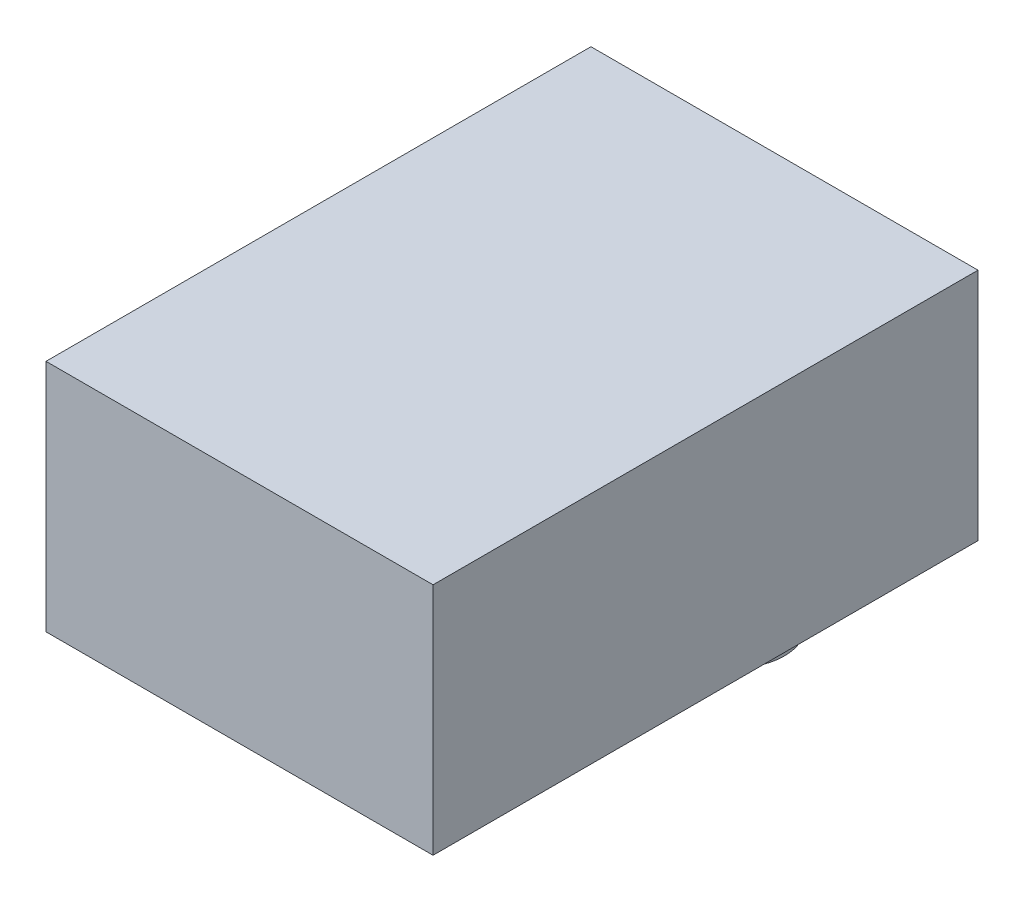
ISO-10303-21;
HEADER;
FILE_DESCRIPTION(('STEP AP214'),'2;1');
FILE_NAME('part.step','',(''),(''),'','','');
FILE_SCHEMA(('AUTOMOTIVE_DESIGN { 1 0 10303 214 1 1 1 1 }'));
ENDSEC;
DATA;
#1=APPLICATION_CONTEXT('core data for automotive mechanical design processes');
#2=APPLICATION_PROTOCOL_DEFINITION('international standard','automotive_design',2000,#1);
#3=PRODUCT_CONTEXT('',#1,'mechanical');
#4=PRODUCT('Part','Part','',(#3));
#5=PRODUCT_RELATED_PRODUCT_CATEGORY('part','',(#4));
#6=PRODUCT_DEFINITION_FORMATION('','',#4);
#7=PRODUCT_DEFINITION_CONTEXT('part definition',#1,'design');
#8=PRODUCT_DEFINITION('design','',#6,#7);
#9=PRODUCT_DEFINITION_SHAPE('','',#8);
#10=(LENGTH_UNIT() NAMED_UNIT(*) SI_UNIT(.MILLI.,.METRE.));
#11=(NAMED_UNIT(*) PLANE_ANGLE_UNIT() SI_UNIT($,.RADIAN.));
#12=(NAMED_UNIT(*) SI_UNIT($,.STERADIAN.) SOLID_ANGLE_UNIT());
#13=UNCERTAINTY_MEASURE_WITH_UNIT(LENGTH_MEASURE(1.E-05),#10,'distance_accuracy_value','');
#14=(GEOMETRIC_REPRESENTATION_CONTEXT(3) GLOBAL_UNCERTAINTY_ASSIGNED_CONTEXT((#13)) GLOBAL_UNIT_ASSIGNED_CONTEXT((#10,
#11,#12)) REPRESENTATION_CONTEXT('',''));
#15=CARTESIAN_POINT('',(0.,0.,0.));
#16=DIRECTION('',(0.,0.,1.));
#17=DIRECTION('',(1.,0.,0.));
#18=AXIS2_PLACEMENT_3D('',#15,#16,#17);
#19=CARTESIAN_POINT('',(0.,9.3,0.));
#20=DIRECTION('',(0.,-1.,0.));
#21=DIRECTION('',(0.,0.,-1.));
#22=AXIS2_PLACEMENT_3D('',#19,#20,#21);
#23=CYLINDRICAL_SURFACE('',#22,2.35);
#24=CARTESIAN_POINT('',(0.,0.,0.));
#25=DIRECTION('',(0.,1.,0.));
#26=DIRECTION('',(0.,0.,1.));
#27=AXIS2_PLACEMENT_3D('',#24,#25,#26);
#28=CIRCLE('',#27,2.35);
#29=CARTESIAN_POINT('',(0.,0.,2.35));
#30=VERTEX_POINT('',#29);
#31=EDGE_CURVE('E181',#30,#30,#28,.T.);
#32=ORIENTED_EDGE('',*,*,#31,.F.);
#33=EDGE_LOOP('',(#32));
#34=FACE_BOUND('',#33,.T.);
#35=CARTESIAN_POINT('',(0.,2.8,0.));
#36=DIRECTION('',(0.,1.,0.));
#37=DIRECTION('',(0.,0.,1.));
#38=AXIS2_PLACEMENT_3D('',#35,#36,#37);
#39=CIRCLE('',#38,2.35);
#40=CARTESIAN_POINT('',(0.,2.8,2.35));
#41=VERTEX_POINT('',#40);
#42=EDGE_CURVE('E53',#41,#41,#39,.T.);
#43=ORIENTED_EDGE('',*,*,#42,.T.);
#44=EDGE_LOOP('',(#43));
#45=FACE_BOUND('',#44,.T.);
#46=ADVANCED_FACE('F51',(#34,#45),#23,.F.);
#47=CARTESIAN_POINT('',(0.,9.3,0.));
#48=DIRECTION('',(0.,-1.,0.));
#49=DIRECTION('',(0.,0.,-1.));
#50=AXIS2_PLACEMENT_3D('',#47,#48,#49);
#51=CYLINDRICAL_SURFACE('',#50,5.);
#52=CARTESIAN_POINT('',(0.,0.,0.));
#53=DIRECTION('',(0.,1.,0.));
#54=DIRECTION('',(0.,0.,1.));
#55=AXIS2_PLACEMENT_3D('',#52,#53,#54);
#56=CIRCLE('',#55,5.);
#57=CARTESIAN_POINT('',(-3.87136521046086,0.,-3.16425842927428));
#58=VERTEX_POINT('',#57);
#59=CARTESIAN_POINT('',(0.5,0.,-4.9749371855331));
#60=VERTEX_POINT('',#59);
#61=EDGE_CURVE('E121',#58,#60,#56,.T.);
#62=ORIENTED_EDGE('',*,*,#61,.T.);
#63=DIRECTION('',(0.,-1.,0.));
#64=VECTOR('',#63,1.);
#65=CARTESIAN_POINT('',(0.5,9.3,-4.9749371855331));
#66=LINE('',#65,#64);
#67=CARTESIAN_POINT('',(0.5,9.3,-4.9749371855331));
#68=VERTEX_POINT('',#67);
#69=EDGE_CURVE('E12',#68,#60,#66,.T.);
#70=ORIENTED_EDGE('',*,*,#69,.F.);
#71=CARTESIAN_POINT('',(0.,9.3,0.));
#72=DIRECTION('',(0.,1.,0.));
#73=DIRECTION('',(0.,0.,1.));
#74=AXIS2_PLACEMENT_3D('',#71,#72,#73);
#75=CIRCLE('',#74,5.);
#76=CARTESIAN_POINT('',(-3.87136521046086,9.3,-3.16425842927428));
#77=VERTEX_POINT('',#76);
#78=EDGE_CURVE('E123',#77,#68,#75,.T.);
#79=ORIENTED_EDGE('',*,*,#78,.F.);
#80=DIRECTION('',(0.,-1.,0.));
#81=VECTOR('',#80,1.);
#82=CARTESIAN_POINT('',(-3.87136521046086,9.3,-3.16425842927428));
#83=LINE('',#82,#81);
#84=EDGE_CURVE('E106',#77,#58,#83,.T.);
#85=ORIENTED_EDGE('',*,*,#84,.T.);
#86=EDGE_LOOP('',(#62,#70,#79,#85));
#87=FACE_BOUND('',#86,.T.);
#88=ADVANCED_FACE('F306',(#87),#51,.T.);
#89=CARTESIAN_POINT('',(0.5,9.3,0.));
#90=DIRECTION('',(1.,0.,0.));
#91=DIRECTION('',(0.,0.,-1.));
#92=AXIS2_PLACEMENT_3D('',#89,#90,#91);
#93=PLANE('',#92);
#94=DIRECTION('',(0.,0.,1.));
#95=VECTOR('',#94,1.);
#96=CARTESIAN_POINT('',(0.5,0.,0.));
#97=LINE('',#96,#95);
#98=CARTESIAN_POINT('',(0.5,0.,-7.));
#99=VERTEX_POINT('',#98);
#100=EDGE_CURVE('E165',#99,#60,#97,.T.);
#101=ORIENTED_EDGE('',*,*,#100,.F.);
#102=DIRECTION('',(0.,-1.,0.));
#103=VECTOR('',#102,1.);
#104=CARTESIAN_POINT('',(0.5,9.3,-7.));
#105=LINE('',#104,#103);
#106=CARTESIAN_POINT('',(0.5,9.3,-7.));
#107=VERTEX_POINT('',#106);
#108=EDGE_CURVE('E63',#107,#99,#105,.T.);
#109=ORIENTED_EDGE('',*,*,#108,.F.);
#110=DIRECTION('',(0.,0.,1.));
#111=VECTOR('',#110,1.);
#112=CARTESIAN_POINT('',(0.5,9.3,0.));
#113=LINE('',#112,#111);
#114=EDGE_CURVE('E126',#107,#68,#113,.T.);
#115=ORIENTED_EDGE('',*,*,#114,.T.);
#116=ORIENTED_EDGE('',*,*,#69,.T.);
#117=EDGE_LOOP('',(#101,#109,#115,#116));
#118=FACE_BOUND('',#117,.T.);
#119=ADVANCED_FACE('F162',(#118),#93,.T.);
#120=CARTESIAN_POINT('',(0.,9.3,-7.));
#121=DIRECTION('',(0.,0.,-1.));
#122=DIRECTION('',(-1.,0.,0.));
#123=AXIS2_PLACEMENT_3D('',#120,#121,#122);
#124=PLANE('',#123);
#125=DIRECTION('',(1.,0.,0.));
#126=VECTOR('',#125,1.);
#127=CARTESIAN_POINT('',(0.,0.,-7.));
#128=LINE('',#127,#126);
#129=CARTESIAN_POINT('',(-0.5,0.,-7.));
#130=VERTEX_POINT('',#129);
#131=EDGE_CURVE('E154',#130,#99,#128,.T.);
#132=ORIENTED_EDGE('',*,*,#131,.F.);
#133=DIRECTION('',(0.,-1.,0.));
#134=VECTOR('',#133,1.);
#135=CARTESIAN_POINT('',(-0.5,9.3,-7.));
#136=LINE('',#135,#134);
#137=CARTESIAN_POINT('',(-0.5,9.3,-7.));
#138=VERTEX_POINT('',#137);
#139=EDGE_CURVE('E141',#138,#130,#136,.T.);
#140=ORIENTED_EDGE('',*,*,#139,.F.);
#141=DIRECTION('',(1.,0.,0.));
#142=VECTOR('',#141,1.);
#143=CARTESIAN_POINT('',(0.,9.3,-7.));
#144=LINE('',#143,#142);
#145=EDGE_CURVE('E157',#138,#107,#144,.T.);
#146=ORIENTED_EDGE('',*,*,#145,.T.);
#147=ORIENTED_EDGE('',*,*,#108,.T.);
#148=EDGE_LOOP('',(#132,#140,#146,#147));
#149=FACE_BOUND('',#148,.T.);
#150=ADVANCED_FACE('F155',(#149),#124,.T.);
#151=CARTESIAN_POINT('',(-0.5,9.3,0.));
#152=DIRECTION('',(-1.,0.,0.));
#153=DIRECTION('',(0.,0.,1.));
#154=AXIS2_PLACEMENT_3D('',#151,#152,#153);
#155=PLANE('',#154);
#156=DIRECTION('',(0.,0.,-1.));
#157=VECTOR('',#156,1.);
#158=CARTESIAN_POINT('',(-0.5,0.,0.));
#159=LINE('',#158,#157);
#160=CARTESIAN_POINT('',(-0.5,0.,-4.9749371855331));
#161=VERTEX_POINT('',#160);
#162=EDGE_CURVE('E166',#161,#130,#159,.T.);
#163=ORIENTED_EDGE('',*,*,#162,.F.);
#164=DIRECTION('',(0.,-1.,0.));
#165=VECTOR('',#164,1.);
#166=CARTESIAN_POINT('',(-0.5,9.3,-4.9749371855331));
#167=LINE('',#166,#165);
#168=CARTESIAN_POINT('',(-0.5,9.3,-4.9749371855331));
#169=VERTEX_POINT('',#168);
#170=EDGE_CURVE('E137',#169,#161,#167,.T.);
#171=ORIENTED_EDGE('',*,*,#170,.F.);
#172=DIRECTION('',(0.,0.,-1.));
#173=VECTOR('',#172,1.);
#174=CARTESIAN_POINT('',(-0.5,9.3,0.));
#175=LINE('',#174,#173);
#176=EDGE_CURVE('E203',#169,#138,#175,.T.);
#177=ORIENTED_EDGE('',*,*,#176,.T.);
#178=ORIENTED_EDGE('',*,*,#139,.T.);
#179=EDGE_LOOP('',(#163,#171,#177,#178));
#180=FACE_BOUND('',#179,.T.);
#181=ADVANCED_FACE('F325',(#180),#155,.T.);
#182=CARTESIAN_POINT('',(-3.16425842927432,0.,-3.87136521046083));
#183=VERTEX_POINT('',#182);
#184=EDGE_CURVE('E172',#161,#183,#56,.T.);
#185=ORIENTED_EDGE('',*,*,#184,.T.);
#186=DIRECTION('',(0.,-1.,0.));
#187=VECTOR('',#186,1.);
#188=CARTESIAN_POINT('',(-3.16425842927432,9.3,-3.87136521046083));
#189=LINE('',#188,#187);
#190=CARTESIAN_POINT('',(-3.16425842927432,9.3,-3.87136521046083));
#191=VERTEX_POINT('',#190);
#192=EDGE_CURVE('E136',#191,#183,#189,.T.);
#193=ORIENTED_EDGE('',*,*,#192,.F.);
#194=EDGE_CURVE('E128',#169,#191,#75,.T.);
#195=ORIENTED_EDGE('',*,*,#194,.F.);
#196=ORIENTED_EDGE('',*,*,#170,.T.);
#197=EDGE_LOOP('',(#185,#193,#195,#196));
#198=FACE_BOUND('',#197,.T.);
#199=ADVANCED_FACE('F313',(#198),#51,.T.);
#200=CARTESIAN_POINT('',(0.353553390593269,9.3,-0.353553390593271));
#201=DIRECTION('',(0.707106781186545,0.,-0.70710678118655));
#202=DIRECTION('',(-0.70710678118655,0.,-0.707106781186545));
#203=AXIS2_PLACEMENT_3D('',#200,#201,#202);
#204=PLANE('',#203);
#205=DIRECTION('',(0.70710678118655,0.,0.707106781186545));
#206=VECTOR('',#205,1.);
#207=CARTESIAN_POINT('',(0.353553390593269,0.,-0.353553390593271));
#208=LINE('',#207,#206);
#209=CARTESIAN_POINT('',(-4.58355102393963,0.,-5.29065780512613));
#210=VERTEX_POINT('',#209);
#211=EDGE_CURVE('E118',#210,#183,#208,.T.);
#212=ORIENTED_EDGE('',*,*,#211,.F.);
#213=DIRECTION('',(0.,-1.,0.));
#214=VECTOR('',#213,1.);
#215=CARTESIAN_POINT('',(-4.58355102393963,9.3,-5.29065780512613));
#216=LINE('',#215,#214);
#217=CARTESIAN_POINT('',(-4.58355102393963,9.3,-5.29065780512613));
#218=VERTEX_POINT('',#217);
#219=EDGE_CURVE('E104',#218,#210,#216,.T.);
#220=ORIENTED_EDGE('',*,*,#219,.F.);
#221=DIRECTION('',(0.70710678118655,0.,0.707106781186545));
#222=VECTOR('',#221,1.);
#223=CARTESIAN_POINT('',(0.353553390593269,9.3,-0.353553390593271));
#224=LINE('',#223,#222);
#225=EDGE_CURVE('E197',#218,#191,#224,.T.);
#226=ORIENTED_EDGE('',*,*,#225,.T.);
#227=ORIENTED_EDGE('',*,*,#192,.T.);
#228=EDGE_LOOP('',(#212,#220,#226,#227));
#229=FACE_BOUND('',#228,.T.);
#230=ADVANCED_FACE('F321',(#229),#204,.T.);
#231=CARTESIAN_POINT('',(-4.9371044145329,9.3,-4.93710441453285));
#232=DIRECTION('',(-0.707106781186551,0.,-0.707106781186544));
#233=DIRECTION('',(-0.707106781186544,0.,0.707106781186551));
#234=AXIS2_PLACEMENT_3D('',#231,#232,#233);
#235=PLANE('',#234);
#236=DIRECTION('',(0.707106781186544,0.,-0.707106781186551));
#237=VECTOR('',#236,1.);
#238=CARTESIAN_POINT('',(-4.9371044145329,0.,-4.93710441453285));
#239=LINE('',#238,#237);
#240=CARTESIAN_POINT('',(-5.29065780512617,0.,-4.58355102393958));
#241=VERTEX_POINT('',#240);
#242=EDGE_CURVE('E108',#241,#210,#239,.T.);
#243=ORIENTED_EDGE('',*,*,#242,.F.);
#244=DIRECTION('',(0.,-1.,0.));
#245=VECTOR('',#244,1.);
#246=CARTESIAN_POINT('',(-5.29065780512617,9.3,-4.58355102393958));
#247=LINE('',#246,#245);
#248=CARTESIAN_POINT('',(-5.29065780512617,9.3,-4.58355102393958));
#249=VERTEX_POINT('',#248);
#250=EDGE_CURVE('E96',#249,#241,#247,.T.);
#251=ORIENTED_EDGE('',*,*,#250,.F.);
#252=DIRECTION('',(0.707106781186544,0.,-0.707106781186551));
#253=VECTOR('',#252,1.);
#254=CARTESIAN_POINT('',(-4.9371044145329,9.3,-4.93710441453285));
#255=LINE('',#254,#253);
#256=EDGE_CURVE('E70',#249,#218,#255,.T.);
#257=ORIENTED_EDGE('',*,*,#256,.T.);
#258=ORIENTED_EDGE('',*,*,#219,.T.);
#259=EDGE_LOOP('',(#243,#251,#257,#258));
#260=FACE_BOUND('',#259,.T.);
#261=ADVANCED_FACE('F109',(#260),#235,.T.);
#262=CARTESIAN_POINT('',(-0.353553390593276,9.3,0.353553390593279));
#263=DIRECTION('',(-0.707106781186545,0.,0.70710678118655));
#264=DIRECTION('',(0.70710678118655,0.,0.707106781186545));
#265=AXIS2_PLACEMENT_3D('',#262,#263,#264);
#266=PLANE('',#265);
#267=DIRECTION('',(-0.70710678118655,0.,-0.707106781186545));
#268=VECTOR('',#267,1.);
#269=CARTESIAN_POINT('',(-0.353553390593276,0.,0.353553390593279));
#270=LINE('',#269,#268);
#271=EDGE_CURVE('E101',#58,#241,#270,.T.);
#272=ORIENTED_EDGE('',*,*,#271,.F.);
#273=ORIENTED_EDGE('',*,*,#84,.F.);
#274=DIRECTION('',(-0.70710678118655,0.,-0.707106781186545));
#275=VECTOR('',#274,1.);
#276=CARTESIAN_POINT('',(-0.353553390593276,9.3,0.353553390593279));
#277=LINE('',#276,#275);
#278=EDGE_CURVE('E105',#77,#249,#277,.T.);
#279=ORIENTED_EDGE('',*,*,#278,.T.);
#280=ORIENTED_EDGE('',*,*,#250,.T.);
#281=EDGE_LOOP('',(#272,#273,#279,#280));
#282=FACE_BOUND('',#281,.T.);
#283=ADVANCED_FACE('F98',(#282),#266,.T.);
#284=CARTESIAN_POINT('',(0.,0.,0.));
#285=DIRECTION('',(0.,1.,0.));
#286=DIRECTION('',(0.,0.,1.));
#287=AXIS2_PLACEMENT_3D('',#284,#285,#286);
#288=PLANE('',#287);
#289=ORIENTED_EDGE('',*,*,#31,.T.);
#290=EDGE_LOOP('',(#289));
#291=FACE_BOUND('',#290,.T.);
#292=ORIENTED_EDGE('',*,*,#61,.F.);
#293=ORIENTED_EDGE('',*,*,#271,.T.);
#294=ORIENTED_EDGE('',*,*,#242,.T.);
#295=ORIENTED_EDGE('',*,*,#211,.T.);
#296=ORIENTED_EDGE('',*,*,#184,.F.);
#297=ORIENTED_EDGE('',*,*,#162,.T.);
#298=ORIENTED_EDGE('',*,*,#131,.T.);
#299=ORIENTED_EDGE('',*,*,#100,.T.);
#300=EDGE_LOOP('',(#292,#293,#294,#295,#296,#297,#298,#299));
#301=FACE_BOUND('',#300,.T.);
#302=ADVANCED_FACE('F120',(#291,#301),#288,.F.);
#303=CARTESIAN_POINT('',(0.,-7.91959594928933,0.));
#304=DIRECTION('',(0.,1.,0.));
#305=DIRECTION('',(0.,0.,1.));
#306=AXIS2_PLACEMENT_3D('',#303,#304,#305);
#307=CYLINDRICAL_SURFACE('',#306,2.8);
#308=CARTESIAN_POINT('',(0.,2.8,0.));
#309=DIRECTION('',(0.,1.,0.));
#310=DIRECTION('',(0.,0.,1.));
#311=AXIS2_PLACEMENT_3D('',#308,#309,#310);
#312=CIRCLE('',#311,2.8);
#313=CARTESIAN_POINT('',(0.,2.8,2.8));
#314=VERTEX_POINT('',#313);
#315=EDGE_CURVE('E194',#314,#314,#312,.F.);
#316=ORIENTED_EDGE('',*,*,#315,.T.);
#317=EDGE_LOOP('',(#316));
#318=FACE_BOUND('',#317,.T.);
#319=CARTESIAN_POINT('',(0.,9.3,0.));
#320=DIRECTION('',(0.,1.,0.));
#321=DIRECTION('',(0.,0.,1.));
#322=AXIS2_PLACEMENT_3D('',#319,#320,#321);
#323=CIRCLE('',#322,2.8);
#324=CARTESIAN_POINT('',(0.,9.3,2.8));
#325=VERTEX_POINT('',#324);
#326=EDGE_CURVE('E215',#325,#325,#323,.T.);
#327=ORIENTED_EDGE('',*,*,#326,.T.);
#328=EDGE_LOOP('',(#327));
#329=FACE_BOUND('',#328,.T.);
#330=ADVANCED_FACE('F383',(#318,#329),#307,.F.);
#331=CARTESIAN_POINT('',(0.,2.8,0.));
#332=DIRECTION('',(0.,1.,0.));
#333=DIRECTION('',(0.,0.,1.));
#334=AXIS2_PLACEMENT_3D('',#331,#332,#333);
#335=PLANE('',#334);
#336=ORIENTED_EDGE('',*,*,#42,.F.);
#337=EDGE_LOOP('',(#336));
#338=FACE_BOUND('',#337,.T.);
#339=ORIENTED_EDGE('',*,*,#315,.F.);
#340=EDGE_LOOP('',(#339));
#341=FACE_BOUND('',#340,.T.);
#342=ADVANCED_FACE('F397',(#338,#341),#335,.T.);
#343=CARTESIAN_POINT('',(0.,32.3,0.));
#344=DIRECTION('',(0.,1.,0.));
#345=DIRECTION('',(0.,0.,1.));
#346=AXIS2_PLACEMENT_3D('',#343,#344,#345);
#347=PLANE('',#346);
#348=DIRECTION('',(0.,0.,1.));
#349=VECTOR('',#348,1.);
#350=CARTESIAN_POINT('',(-24.,32.3,-10.));
#351=LINE('',#350,#349);
#352=CARTESIAN_POINT('',(-24.,32.3,-10.));
#353=VERTEX_POINT('',#352);
#354=CARTESIAN_POINT('',(-24.,32.3,43.5));
#355=VERTEX_POINT('',#354);
#356=EDGE_CURVE('E240',#353,#355,#351,.T.);
#357=ORIENTED_EDGE('',*,*,#356,.T.);
#358=DIRECTION('',(1.,0.,0.));
#359=VECTOR('',#358,1.);
#360=CARTESIAN_POINT('',(-24.,32.3,43.5));
#361=LINE('',#360,#359);
#362=CARTESIAN_POINT('',(14.,32.3,43.5));
#363=VERTEX_POINT('',#362);
#364=EDGE_CURVE('E260',#355,#363,#361,.T.);
#365=ORIENTED_EDGE('',*,*,#364,.T.);
#366=DIRECTION('',(0.,0.,-1.));
#367=VECTOR('',#366,1.);
#368=CARTESIAN_POINT('',(14.,32.3,-10.));
#369=LINE('',#368,#367);
#370=CARTESIAN_POINT('',(14.,32.3,-10.));
#371=VERTEX_POINT('',#370);
#372=EDGE_CURVE('E251',#363,#371,#369,.T.);
#373=ORIENTED_EDGE('',*,*,#372,.T.);
#374=DIRECTION('',(-1.,0.,0.));
#375=VECTOR('',#374,1.);
#376=CARTESIAN_POINT('',(-24.,32.3,-10.));
#377=LINE('',#376,#375);
#378=EDGE_CURVE('E231',#371,#353,#377,.T.);
#379=ORIENTED_EDGE('',*,*,#378,.T.);
#380=EDGE_LOOP('',(#357,#365,#373,#379));
#381=FACE_BOUND('',#380,.T.);
#382=ADVANCED_FACE('F270',(#381),#347,.T.);
#383=CARTESIAN_POINT('',(-24.,32.3,-10.));
#384=DIRECTION('',(0.,0.,1.));
#385=DIRECTION('',(1.,0.,0.));
#386=AXIS2_PLACEMENT_3D('',#383,#384,#385);
#387=PLANE('',#386);
#388=DIRECTION('',(-1.,0.,0.));
#389=VECTOR('',#388,1.);
#390=CARTESIAN_POINT('',(-24.,9.3,-10.));
#391=LINE('',#390,#389);
#392=CARTESIAN_POINT('',(14.,9.3,-10.));
#393=VERTEX_POINT('',#392);
#394=CARTESIAN_POINT('',(-24.,9.3,-10.));
#395=VERTEX_POINT('',#394);
#396=EDGE_CURVE('E235',#393,#395,#391,.T.);
#397=ORIENTED_EDGE('',*,*,#396,.T.);
#398=DIRECTION('',(0.,-1.,0.));
#399=VECTOR('',#398,1.);
#400=CARTESIAN_POINT('',(-24.,32.3,-10.));
#401=LINE('',#400,#399);
#402=EDGE_CURVE('E227',#353,#395,#401,.T.);
#403=ORIENTED_EDGE('',*,*,#402,.F.);
#404=ORIENTED_EDGE('',*,*,#378,.F.);
#405=DIRECTION('',(0.,-1.,0.));
#406=VECTOR('',#405,1.);
#407=CARTESIAN_POINT('',(14.,32.3,-10.));
#408=LINE('',#407,#406);
#409=EDGE_CURVE('E221',#371,#393,#408,.T.);
#410=ORIENTED_EDGE('',*,*,#409,.T.);
#411=EDGE_LOOP('',(#397,#403,#404,#410));
#412=FACE_BOUND('',#411,.T.);
#413=ADVANCED_FACE('F418',(#412),#387,.F.);
#414=CARTESIAN_POINT('',(14.,32.3,-10.));
#415=DIRECTION('',(-1.,0.,0.));
#416=DIRECTION('',(0.,0.,1.));
#417=AXIS2_PLACEMENT_3D('',#414,#415,#416);
#418=PLANE('',#417);
#419=DIRECTION('',(0.,0.,-1.));
#420=VECTOR('',#419,1.);
#421=CARTESIAN_POINT('',(14.,9.3,-10.));
#422=LINE('',#421,#420);
#423=CARTESIAN_POINT('',(14.,9.3,43.5));
#424=VERTEX_POINT('',#423);
#425=EDGE_CURVE('E236',#424,#393,#422,.T.);
#426=ORIENTED_EDGE('',*,*,#425,.T.);
#427=ORIENTED_EDGE('',*,*,#409,.F.);
#428=ORIENTED_EDGE('',*,*,#372,.F.);
#429=DIRECTION('',(0.,-1.,0.));
#430=VECTOR('',#429,1.);
#431=CARTESIAN_POINT('',(14.,32.3,43.5));
#432=LINE('',#431,#430);
#433=EDGE_CURVE('E219',#363,#424,#432,.T.);
#434=ORIENTED_EDGE('',*,*,#433,.T.);
#435=EDGE_LOOP('',(#426,#427,#428,#434));
#436=FACE_BOUND('',#435,.T.);
#437=ADVANCED_FACE('F424',(#436),#418,.F.);
#438=CARTESIAN_POINT('',(-24.,32.3,43.5));
#439=DIRECTION('',(0.,0.,-1.));
#440=DIRECTION('',(-1.,0.,0.));
#441=AXIS2_PLACEMENT_3D('',#438,#439,#440);
#442=PLANE('',#441);
#443=DIRECTION('',(1.,0.,0.));
#444=VECTOR('',#443,1.);
#445=CARTESIAN_POINT('',(-24.,9.3,43.5));
#446=LINE('',#445,#444);
#447=CARTESIAN_POINT('',(-24.,9.3,43.5));
#448=VERTEX_POINT('',#447);
#449=EDGE_CURVE('E244',#448,#424,#446,.T.);
#450=ORIENTED_EDGE('',*,*,#449,.T.);
#451=ORIENTED_EDGE('',*,*,#433,.F.);
#452=ORIENTED_EDGE('',*,*,#364,.F.);
#453=DIRECTION('',(0.,-1.,0.));
#454=VECTOR('',#453,1.);
#455=CARTESIAN_POINT('',(-24.,32.3,43.5));
#456=LINE('',#455,#454);
#457=EDGE_CURVE('E216',#355,#448,#456,.T.);
#458=ORIENTED_EDGE('',*,*,#457,.T.);
#459=EDGE_LOOP('',(#450,#451,#452,#458));
#460=FACE_BOUND('',#459,.T.);
#461=ADVANCED_FACE('F283',(#460),#442,.F.);
#462=CARTESIAN_POINT('',(-24.,32.3,-10.));
#463=DIRECTION('',(1.,0.,0.));
#464=DIRECTION('',(0.,0.,-1.));
#465=AXIS2_PLACEMENT_3D('',#462,#463,#464);
#466=PLANE('',#465);
#467=DIRECTION('',(0.,0.,1.));
#468=VECTOR('',#467,1.);
#469=CARTESIAN_POINT('',(-24.,9.3,-10.));
#470=LINE('',#469,#468);
#471=EDGE_CURVE('E249',#395,#448,#470,.T.);
#472=ORIENTED_EDGE('',*,*,#471,.T.);
#473=ORIENTED_EDGE('',*,*,#457,.F.);
#474=ORIENTED_EDGE('',*,*,#356,.F.);
#475=ORIENTED_EDGE('',*,*,#402,.T.);
#476=EDGE_LOOP('',(#472,#473,#474,#475));
#477=FACE_BOUND('',#476,.T.);
#478=ADVANCED_FACE('F280',(#477),#466,.F.);
#479=CARTESIAN_POINT('',(0.,9.3,0.));
#480=DIRECTION('',(0.,1.,0.));
#481=DIRECTION('',(0.,0.,1.));
#482=AXIS2_PLACEMENT_3D('',#479,#480,#481);
#483=PLANE('',#482);
#484=ORIENTED_EDGE('',*,*,#471,.F.);
#485=ORIENTED_EDGE('',*,*,#396,.F.);
#486=ORIENTED_EDGE('',*,*,#425,.F.);
#487=ORIENTED_EDGE('',*,*,#449,.F.);
#488=EDGE_LOOP('',(#484,#485,#486,#487));
#489=FACE_BOUND('',#488,.T.);
#490=ORIENTED_EDGE('',*,*,#278,.F.);
#491=ORIENTED_EDGE('',*,*,#78,.T.);
#492=ORIENTED_EDGE('',*,*,#114,.F.);
#493=ORIENTED_EDGE('',*,*,#145,.F.);
#494=ORIENTED_EDGE('',*,*,#176,.F.);
#495=ORIENTED_EDGE('',*,*,#194,.T.);
#496=ORIENTED_EDGE('',*,*,#225,.F.);
#497=ORIENTED_EDGE('',*,*,#256,.F.);
#498=EDGE_LOOP('',(#490,#491,#492,#493,#494,#495,#496,#497));
#499=FACE_BOUND('',#498,.T.);
#500=ADVANCED_FACE('F307',(#489,#499),#483,.F.);
#501=ORIENTED_EDGE('',*,*,#326,.F.);
#502=EDGE_LOOP('',(#501));
#503=FACE_BOUND('',#502,.T.);
#504=ADVANCED_FACE('F452',(#503),#483,.F.);
#505=CLOSED_SHELL('',(#46,#88,#119,#150,#181,#199,#230,#261,#283,#302,#330,#342,#382,#413,#437,
#461,#478,#500,#504));
#506=MANIFOLD_SOLID_BREP('B2',#505);
#507=ADVANCED_BREP_SHAPE_REPRESENTATION('',(#18,#506),#14);
#508=SHAPE_DEFINITION_REPRESENTATION(#9,#507);
ENDSEC;
END-ISO-10303-21;
